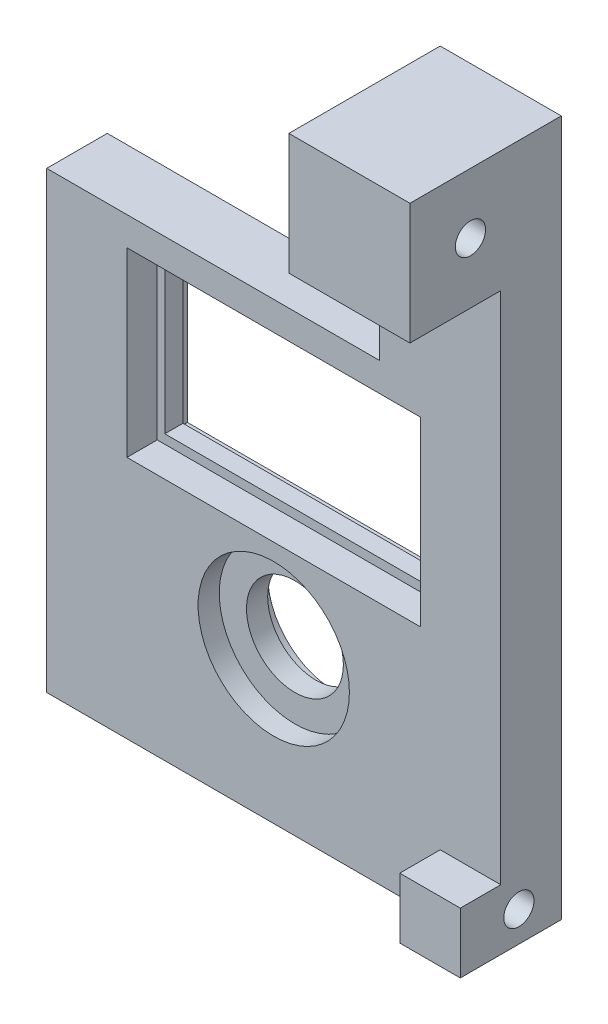
ISO-10303-21;
HEADER;
FILE_DESCRIPTION(('STEP AP214'),'2;1');
FILE_NAME('part.step','',(''),(''),'','','');
FILE_SCHEMA(('AUTOMOTIVE_DESIGN { 1 0 10303 214 1 1 1 1 }'));
ENDSEC;
DATA;
#1=APPLICATION_CONTEXT('core data for automotive mechanical design processes');
#2=APPLICATION_PROTOCOL_DEFINITION('international standard','automotive_design',2000,#1);
#3=PRODUCT_CONTEXT('',#1,'mechanical');
#4=PRODUCT('Part','Part','',(#3));
#5=PRODUCT_RELATED_PRODUCT_CATEGORY('part','',(#4));
#6=PRODUCT_DEFINITION_FORMATION('','',#4);
#7=PRODUCT_DEFINITION_CONTEXT('part definition',#1,'design');
#8=PRODUCT_DEFINITION('design','',#6,#7);
#9=PRODUCT_DEFINITION_SHAPE('','',#8);
#10=(LENGTH_UNIT() NAMED_UNIT(*) SI_UNIT(.MILLI.,.METRE.));
#11=(NAMED_UNIT(*) PLANE_ANGLE_UNIT() SI_UNIT($,.RADIAN.));
#12=(NAMED_UNIT(*) SI_UNIT($,.STERADIAN.) SOLID_ANGLE_UNIT());
#13=UNCERTAINTY_MEASURE_WITH_UNIT(LENGTH_MEASURE(1.E-05),#10,'distance_accuracy_value','');
#14=(GEOMETRIC_REPRESENTATION_CONTEXT(3) GLOBAL_UNCERTAINTY_ASSIGNED_CONTEXT((#13)) GLOBAL_UNIT_ASSIGNED_CONTEXT((#10,
#11,#12)) REPRESENTATION_CONTEXT('',''));
#15=CARTESIAN_POINT('',(0.,0.,0.));
#16=DIRECTION('',(0.,0.,1.));
#17=DIRECTION('',(1.,0.,0.));
#18=AXIS2_PLACEMENT_3D('',#15,#16,#17);
#19=CARTESIAN_POINT('',(-23.,-15.7340796764345,25.001));
#20=DIRECTION('',(-1.,0.,0.));
#21=DIRECTION('',(0.,0.,1.));
#22=AXIS2_PLACEMENT_3D('',#19,#20,#21);
#23=PLANE('',#22);
#24=DIRECTION('',(0.,1.,0.));
#25=VECTOR('',#24,1.);
#26=CARTESIAN_POINT('',(-23.,-15.7340796764345,5.));
#27=LINE('',#26,#25);
#28=CARTESIAN_POINT('',(-23.,-15.7340796764345,5.));
#29=VERTEX_POINT('',#28);
#30=CARTESIAN_POINT('',(-23.,11.2659203235655,5.));
#31=VERTEX_POINT('',#30);
#32=EDGE_CURVE('E60',#29,#31,#27,.T.);
#33=ORIENTED_EDGE('',*,*,#32,.F.);
#34=DIRECTION('',(0.,0.,-1.));
#35=VECTOR('',#34,1.);
#36=CARTESIAN_POINT('',(-23.,-15.7340796764345,25.001));
#37=LINE('',#36,#35);
#38=CARTESIAN_POINT('',(-23.,-15.7340796764345,2.));
#39=VERTEX_POINT('',#38);
#40=EDGE_CURVE('E274',#29,#39,#37,.T.);
#41=ORIENTED_EDGE('',*,*,#40,.T.);
#42=DIRECTION('',(0.,1.,0.));
#43=VECTOR('',#42,1.);
#44=CARTESIAN_POINT('',(-23.,-15.7340796764345,2.));
#45=LINE('',#44,#43);
#46=CARTESIAN_POINT('',(-23.,11.2659203235655,2.));
#47=VERTEX_POINT('',#46);
#48=EDGE_CURVE('E270',#39,#47,#45,.T.);
#49=ORIENTED_EDGE('',*,*,#48,.T.);
#50=DIRECTION('',(0.,0.,-1.));
#51=VECTOR('',#50,1.);
#52=CARTESIAN_POINT('',(-23.,11.2659203235655,25.001));
#53=LINE('',#52,#51);
#54=EDGE_CURVE('E273',#31,#47,#53,.T.);
#55=ORIENTED_EDGE('',*,*,#54,.F.);
#56=EDGE_LOOP('',(#33,#41,#49,#55));
#57=FACE_BOUND('',#56,.T.);
#58=ADVANCED_FACE('F38',(#57),#23,.F.);
#59=CARTESIAN_POINT('',(23.,-15.7340796764345,25.001));
#60=DIRECTION('',(0.,-1.,0.));
#61=DIRECTION('',(0.,0.,-1.));
#62=AXIS2_PLACEMENT_3D('',#59,#60,#61);
#63=PLANE('',#62);
#64=DIRECTION('',(-1.,0.,0.));
#65=VECTOR('',#64,1.);
#66=CARTESIAN_POINT('',(23.,-15.7340796764345,5.));
#67=LINE('',#66,#65);
#68=CARTESIAN_POINT('',(23.,-15.7340796764345,5.));
#69=VERTEX_POINT('',#68);
#70=EDGE_CURVE('E229',#69,#29,#67,.T.);
#71=ORIENTED_EDGE('',*,*,#70,.F.);
#72=DIRECTION('',(0.,0.,-1.));
#73=VECTOR('',#72,1.);
#74=CARTESIAN_POINT('',(23.,-15.7340796764345,25.001));
#75=LINE('',#74,#73);
#76=CARTESIAN_POINT('',(23.,-15.7340796764345,2.));
#77=VERTEX_POINT('',#76);
#78=EDGE_CURVE('E277',#69,#77,#75,.T.);
#79=ORIENTED_EDGE('',*,*,#78,.T.);
#80=DIRECTION('',(-1.,0.,0.));
#81=VECTOR('',#80,1.);
#82=CARTESIAN_POINT('',(23.,-15.7340796764345,2.));
#83=LINE('',#82,#81);
#84=EDGE_CURVE('E267',#77,#39,#83,.T.);
#85=ORIENTED_EDGE('',*,*,#84,.T.);
#86=ORIENTED_EDGE('',*,*,#40,.F.);
#87=EDGE_LOOP('',(#71,#79,#85,#86));
#88=FACE_BOUND('',#87,.T.);
#89=ADVANCED_FACE('F397',(#88),#63,.F.);
#90=CARTESIAN_POINT('',(23.,-15.7340796764345,25.001));
#91=DIRECTION('',(1.,0.,0.));
#92=DIRECTION('',(0.,1.,0.));
#93=AXIS2_PLACEMENT_3D('',#90,#91,#92);
#94=PLANE('',#93);
#95=DIRECTION('',(0.,-1.,0.));
#96=VECTOR('',#95,1.);
#97=CARTESIAN_POINT('',(23.,-15.7340796764345,5.));
#98=LINE('',#97,#96);
#99=CARTESIAN_POINT('',(23.,11.2659203235655,5.));
#100=VERTEX_POINT('',#99);
#101=EDGE_CURVE('E226',#100,#69,#98,.T.);
#102=ORIENTED_EDGE('',*,*,#101,.F.);
#103=DIRECTION('',(0.,0.,-1.));
#104=VECTOR('',#103,1.);
#105=CARTESIAN_POINT('',(23.,11.2659203235655,25.001));
#106=LINE('',#105,#104);
#107=CARTESIAN_POINT('',(23.,11.2659203235655,2.));
#108=VERTEX_POINT('',#107);
#109=EDGE_CURVE('E279',#100,#108,#106,.T.);
#110=ORIENTED_EDGE('',*,*,#109,.T.);
#111=DIRECTION('',(0.,-1.,0.));
#112=VECTOR('',#111,1.);
#113=CARTESIAN_POINT('',(23.,-15.7340796764345,2.));
#114=LINE('',#113,#112);
#115=EDGE_CURVE('E258',#108,#77,#114,.T.);
#116=ORIENTED_EDGE('',*,*,#115,.T.);
#117=ORIENTED_EDGE('',*,*,#78,.F.);
#118=EDGE_LOOP('',(#102,#110,#116,#117));
#119=FACE_BOUND('',#118,.T.);
#120=ADVANCED_FACE('F401',(#119),#94,.F.);
#121=CARTESIAN_POINT('',(23.,11.2659203235655,25.001));
#122=DIRECTION('',(0.,1.,0.));
#123=DIRECTION('',(0.,0.,1.));
#124=AXIS2_PLACEMENT_3D('',#121,#122,#123);
#125=PLANE('',#124);
#126=DIRECTION('',(1.,0.,0.));
#127=VECTOR('',#126,1.);
#128=CARTESIAN_POINT('',(23.,11.2659203235655,5.));
#129=LINE('',#128,#127);
#130=EDGE_CURVE('E12',#31,#100,#129,.T.);
#131=ORIENTED_EDGE('',*,*,#130,.F.);
#132=ORIENTED_EDGE('',*,*,#54,.T.);
#133=DIRECTION('',(1.,0.,0.));
#134=VECTOR('',#133,1.);
#135=CARTESIAN_POINT('',(23.,11.2659203235655,2.));
#136=LINE('',#135,#134);
#137=EDGE_CURVE('E46',#47,#108,#136,.T.);
#138=ORIENTED_EDGE('',*,*,#137,.T.);
#139=ORIENTED_EDGE('',*,*,#109,.F.);
#140=EDGE_LOOP('',(#131,#132,#138,#139));
#141=FACE_BOUND('',#140,.T.);
#142=ADVANCED_FACE('F386',(#141),#125,.F.);
#143=CARTESIAN_POINT('',(0.,0.,10.));
#144=DIRECTION('',(0.,0.,-1.));
#145=DIRECTION('',(-1.,0.,0.));
#146=AXIS2_PLACEMENT_3D('',#143,#144,#145);
#147=PLANE('',#146);
#148=DIRECTION('',(-1.,0.,0.));
#149=VECTOR('',#148,1.);
#150=CARTESIAN_POINT('',(-24.25,12.7659203235655,10.));
#151=LINE('',#150,#149);
#152=CARTESIAN_POINT('',(24.25,12.7659203235655,10.));
#153=VERTEX_POINT('',#152);
#154=CARTESIAN_POINT('',(-24.25,12.7659203235655,10.));
#155=VERTEX_POINT('',#154);
#156=EDGE_CURVE('E208',#153,#155,#151,.T.);
#157=ORIENTED_EDGE('',*,*,#156,.F.);
#158=DIRECTION('',(0.,1.,0.));
#159=VECTOR('',#158,1.);
#160=CARTESIAN_POINT('',(24.25,-17.2340796764345,10.));
#161=LINE('',#160,#159);
#162=CARTESIAN_POINT('',(24.25,-17.2340796764345,10.));
#163=VERTEX_POINT('',#162);
#164=EDGE_CURVE('E53',#163,#153,#161,.T.);
#165=ORIENTED_EDGE('',*,*,#164,.F.);
#166=DIRECTION('',(1.,0.,0.));
#167=VECTOR('',#166,1.);
#168=CARTESIAN_POINT('',(-24.25,-17.2340796764345,10.));
#169=LINE('',#168,#167);
#170=CARTESIAN_POINT('',(-24.25,-17.2340796764345,10.));
#171=VERTEX_POINT('',#170);
#172=EDGE_CURVE('E215',#171,#163,#169,.T.);
#173=ORIENTED_EDGE('',*,*,#172,.F.);
#174=DIRECTION('',(0.,-1.,0.));
#175=VECTOR('',#174,1.);
#176=CARTESIAN_POINT('',(-24.25,-17.2340796764345,10.));
#177=LINE('',#176,#175);
#178=EDGE_CURVE('E198',#155,#171,#177,.T.);
#179=ORIENTED_EDGE('',*,*,#178,.F.);
#180=EDGE_LOOP('',(#157,#165,#173,#179));
#181=FACE_BOUND('',#180,.T.);
#182=CARTESIAN_POINT('',(0.,-32.5,10.));
#183=DIRECTION('',(0.,0.,1.));
#184=DIRECTION('',(1.,0.,0.));
#185=AXIS2_PLACEMENT_3D('',#182,#183,#184);
#186=CIRCLE('',#185,12.5);
#187=CARTESIAN_POINT('',(12.5,-32.5,10.));
#188=VERTEX_POINT('',#187);
#189=EDGE_CURVE('E345',#188,#188,#186,.T.);
#190=ORIENTED_EDGE('',*,*,#189,.F.);
#191=EDGE_LOOP('',(#190));
#192=FACE_BOUND('',#191,.T.);
#193=DIRECTION('',(0.,1.,0.));
#194=VECTOR('',#193,1.);
#195=CARTESIAN_POINT('',(17.5,57.5,10.));
#196=LINE('',#195,#194);
#197=CARTESIAN_POINT('',(17.5,17.5,10.));
#198=VERTEX_POINT('',#197);
#199=CARTESIAN_POINT('',(17.5,37.5,10.));
#200=VERTEX_POINT('',#199);
#201=EDGE_CURVE('E284',#198,#200,#196,.T.);
#202=ORIENTED_EDGE('',*,*,#201,.F.);
#203=DIRECTION('',(1.,0.,0.));
#204=VECTOR('',#203,1.);
#205=CARTESIAN_POINT('',(17.5,17.5,10.));
#206=LINE('',#205,#204);
#207=CARTESIAN_POINT('',(-37.5,17.5,10.));
#208=VERTEX_POINT('',#207);
#209=EDGE_CURVE('E276',#208,#198,#206,.T.);
#210=ORIENTED_EDGE('',*,*,#209,.F.);
#211=DIRECTION('',(0.,-1.,0.));
#212=VECTOR('',#211,1.);
#213=CARTESIAN_POINT('',(-37.5,-57.5,10.));
#214=LINE('',#213,#212);
#215=CARTESIAN_POINT('',(-37.5,-57.5,10.));
#216=VERTEX_POINT('',#215);
#217=EDGE_CURVE('E350',#208,#216,#214,.T.);
#218=ORIENTED_EDGE('',*,*,#217,.T.);
#219=DIRECTION('',(1.,0.,0.));
#220=VECTOR('',#219,1.);
#221=CARTESIAN_POINT('',(-37.5,-57.5,10.));
#222=LINE('',#221,#220);
#223=CARTESIAN_POINT('',(27.5,-57.5,10.));
#224=VERTEX_POINT('',#223);
#225=EDGE_CURVE('E353',#216,#224,#222,.T.);
#226=ORIENTED_EDGE('',*,*,#225,.T.);
#227=DIRECTION('',(0.,1.,0.));
#228=VECTOR('',#227,1.);
#229=CARTESIAN_POINT('',(27.5,-57.5,10.));
#230=LINE('',#229,#228);
#231=CARTESIAN_POINT('',(27.5,-47.5,10.));
#232=VERTEX_POINT('',#231);
#233=EDGE_CURVE('E291',#224,#232,#230,.T.);
#234=ORIENTED_EDGE('',*,*,#233,.T.);
#235=DIRECTION('',(1.,0.,0.));
#236=VECTOR('',#235,1.);
#237=CARTESIAN_POINT('',(27.5,-47.5,10.));
#238=LINE('',#237,#236);
#239=CARTESIAN_POINT('',(37.5,-47.5,10.));
#240=VERTEX_POINT('',#239);
#241=EDGE_CURVE('E303',#232,#240,#238,.T.);
#242=ORIENTED_EDGE('',*,*,#241,.T.);
#243=DIRECTION('',(0.,1.,0.));
#244=VECTOR('',#243,1.);
#245=CARTESIAN_POINT('',(37.5,-57.5,10.));
#246=LINE('',#245,#244);
#247=CARTESIAN_POINT('',(37.5,37.5,10.));
#248=VERTEX_POINT('',#247);
#249=EDGE_CURVE('E348',#240,#248,#246,.T.);
#250=ORIENTED_EDGE('',*,*,#249,.T.);
#251=DIRECTION('',(1.,0.,0.));
#252=VECTOR('',#251,1.);
#253=CARTESIAN_POINT('',(17.5,37.5,10.));
#254=LINE('',#253,#252);
#255=EDGE_CURVE('E311',#200,#248,#254,.T.);
#256=ORIENTED_EDGE('',*,*,#255,.F.);
#257=EDGE_LOOP('',(#202,#210,#218,#226,#234,#242,#250,#256));
#258=FACE_BOUND('',#257,.T.);
#259=ADVANCED_FACE('F212',(#181,#192,#258),#147,.F.);
#260=CARTESIAN_POINT('',(-37.5,57.5,10.));
#261=DIRECTION('',(0.,-1.,0.));
#262=DIRECTION('',(0.,0.,-1.));
#263=AXIS2_PLACEMENT_3D('',#260,#261,#262);
#264=PLANE('',#263);
#265=DIRECTION('',(-1.,0.,0.));
#266=VECTOR('',#265,1.);
#267=CARTESIAN_POINT('',(-37.5,57.5,0.));
#268=LINE('',#267,#266);
#269=CARTESIAN_POINT('',(37.5,57.5,0.));
#270=VERTEX_POINT('',#269);
#271=CARTESIAN_POINT('',(17.5,57.5,0.));
#272=VERTEX_POINT('',#271);
#273=EDGE_CURVE('E359',#270,#272,#268,.T.);
#274=ORIENTED_EDGE('',*,*,#273,.T.);
#275=DIRECTION('',(0.,0.,-1.));
#276=VECTOR('',#275,1.);
#277=CARTESIAN_POINT('',(17.5,57.5,25.));
#278=LINE('',#277,#276);
#279=CARTESIAN_POINT('',(17.5,57.5,25.));
#280=VERTEX_POINT('',#279);
#281=EDGE_CURVE('E332',#280,#272,#278,.T.);
#282=ORIENTED_EDGE('',*,*,#281,.F.);
#283=DIRECTION('',(-1.,0.,0.));
#284=VECTOR('',#283,1.);
#285=CARTESIAN_POINT('',(37.5,57.5,25.));
#286=LINE('',#285,#284);
#287=CARTESIAN_POINT('',(37.5,57.5,25.));
#288=VERTEX_POINT('',#287);
#289=EDGE_CURVE('E318',#288,#280,#286,.T.);
#290=ORIENTED_EDGE('',*,*,#289,.F.);
#291=DIRECTION('',(0.,0.,-1.));
#292=VECTOR('',#291,1.);
#293=CARTESIAN_POINT('',(37.5,57.5,10.));
#294=LINE('',#293,#292);
#295=EDGE_CURVE('E370',#288,#270,#294,.T.);
#296=ORIENTED_EDGE('',*,*,#295,.T.);
#297=EDGE_LOOP('',(#274,#282,#290,#296));
#298=FACE_BOUND('',#297,.T.);
#299=ADVANCED_FACE('F481',(#298),#264,.F.);
#300=CARTESIAN_POINT('',(-37.5,-57.5,10.));
#301=DIRECTION('',(1.,0.,0.));
#302=DIRECTION('',(0.,0.,-1.));
#303=AXIS2_PLACEMENT_3D('',#300,#301,#302);
#304=PLANE('',#303);
#305=DIRECTION('',(0.,0.,1.));
#306=VECTOR('',#305,1.);
#307=CARTESIAN_POINT('',(-37.5,17.5,-1.2E-05));
#308=LINE('',#307,#306);
#309=CARTESIAN_POINT('',(-37.5,17.5,0.));
#310=VERTEX_POINT('',#309);
#311=EDGE_CURVE('E286',#310,#208,#308,.T.);
#312=ORIENTED_EDGE('',*,*,#311,.F.);
#313=DIRECTION('',(0.,-1.,0.));
#314=VECTOR('',#313,1.);
#315=CARTESIAN_POINT('',(-37.5,-57.5,0.));
#316=LINE('',#315,#314);
#317=CARTESIAN_POINT('',(-37.5,-57.5,0.));
#318=VERTEX_POINT('',#317);
#319=EDGE_CURVE('E362',#310,#318,#316,.T.);
#320=ORIENTED_EDGE('',*,*,#319,.T.);
#321=DIRECTION('',(0.,0.,-1.));
#322=VECTOR('',#321,1.);
#323=CARTESIAN_POINT('',(-37.5,-57.5,10.));
#324=LINE('',#323,#322);
#325=EDGE_CURVE('E367',#216,#318,#324,.T.);
#326=ORIENTED_EDGE('',*,*,#325,.F.);
#327=ORIENTED_EDGE('',*,*,#217,.F.);
#328=EDGE_LOOP('',(#312,#320,#326,#327));
#329=FACE_BOUND('',#328,.T.);
#330=ADVANCED_FACE('F484',(#329),#304,.F.);
#331=CARTESIAN_POINT('',(0.,0.,0.));
#332=DIRECTION('',(0.,0.,-1.));
#333=DIRECTION('',(-1.,0.,0.));
#334=AXIS2_PLACEMENT_3D('',#331,#332,#333);
#335=PLANE('',#334);
#336=DIRECTION('',(0.,1.,0.));
#337=VECTOR('',#336,1.);
#338=CARTESIAN_POINT('',(-24.25,-17.2340796764345,0.));
#339=LINE('',#338,#337);
#340=CARTESIAN_POINT('',(-24.25,-17.2340796764345,0.));
#341=VERTEX_POINT('',#340);
#342=CARTESIAN_POINT('',(-24.25,12.7659203235655,0.));
#343=VERTEX_POINT('',#342);
#344=EDGE_CURVE('E232',#341,#343,#339,.T.);
#345=ORIENTED_EDGE('',*,*,#344,.F.);
#346=DIRECTION('',(-1.,0.,0.));
#347=VECTOR('',#346,1.);
#348=CARTESIAN_POINT('',(24.25,-17.2340796764345,0.));
#349=LINE('',#348,#347);
#350=CARTESIAN_POINT('',(24.25,-17.2340796764345,0.));
#351=VERTEX_POINT('',#350);
#352=EDGE_CURVE('E237',#351,#341,#349,.T.);
#353=ORIENTED_EDGE('',*,*,#352,.F.);
#354=DIRECTION('',(0.,-1.,0.));
#355=VECTOR('',#354,1.);
#356=CARTESIAN_POINT('',(24.25,-17.2340796764345,0.));
#357=LINE('',#356,#355);
#358=CARTESIAN_POINT('',(24.25,12.7659203235655,0.));
#359=VERTEX_POINT('',#358);
#360=EDGE_CURVE('E251',#359,#351,#357,.T.);
#361=ORIENTED_EDGE('',*,*,#360,.F.);
#362=DIRECTION('',(1.,0.,0.));
#363=VECTOR('',#362,1.);
#364=CARTESIAN_POINT('',(24.25,12.7659203235655,0.));
#365=LINE('',#364,#363);
#366=EDGE_CURVE('E248',#343,#359,#365,.T.);
#367=ORIENTED_EDGE('',*,*,#366,.F.);
#368=EDGE_LOOP('',(#345,#353,#361,#367));
#369=FACE_BOUND('',#368,.T.);
#370=CARTESIAN_POINT('',(0.,-32.5,0.));
#371=DIRECTION('',(0.,0.,-1.));
#372=DIRECTION('',(-1.,0.,0.));
#373=AXIS2_PLACEMENT_3D('',#370,#371,#372);
#374=CIRCLE('',#373,11.);
#375=CARTESIAN_POINT('',(-11.,-32.5,0.));
#376=VERTEX_POINT('',#375);
#377=EDGE_CURVE('E334',#376,#376,#374,.T.);
#378=ORIENTED_EDGE('',*,*,#377,.F.);
#379=EDGE_LOOP('',(#378));
#380=FACE_BOUND('',#379,.T.);
#381=DIRECTION('',(1.,0.,0.));
#382=VECTOR('',#381,1.);
#383=CARTESIAN_POINT('',(0.,17.5,0.));
#384=LINE('',#383,#382);
#385=CARTESIAN_POINT('',(17.5,17.5,0.));
#386=VERTEX_POINT('',#385);
#387=EDGE_CURVE('E373',#310,#386,#384,.T.);
#388=ORIENTED_EDGE('',*,*,#387,.T.);
#389=DIRECTION('',(0.,1.,0.));
#390=VECTOR('',#389,1.);
#391=CARTESIAN_POINT('',(17.5,0.,0.));
#392=LINE('',#391,#390);
#393=EDGE_CURVE('E380',#386,#272,#392,.T.);
#394=ORIENTED_EDGE('',*,*,#393,.T.);
#395=ORIENTED_EDGE('',*,*,#273,.F.);
#396=DIRECTION('',(0.,1.,0.));
#397=VECTOR('',#396,1.);
#398=CARTESIAN_POINT('',(37.5,-57.5,0.));
#399=LINE('',#398,#397);
#400=CARTESIAN_POINT('',(37.5,-57.5,0.));
#401=VERTEX_POINT('',#400);
#402=EDGE_CURVE('E356',#401,#270,#399,.T.);
#403=ORIENTED_EDGE('',*,*,#402,.F.);
#404=DIRECTION('',(1.,0.,0.));
#405=VECTOR('',#404,1.);
#406=CARTESIAN_POINT('',(-37.5,-57.5,0.));
#407=LINE('',#406,#405);
#408=EDGE_CURVE('E351',#318,#401,#407,.T.);
#409=ORIENTED_EDGE('',*,*,#408,.F.);
#410=ORIENTED_EDGE('',*,*,#319,.F.);
#411=EDGE_LOOP('',(#388,#394,#395,#403,#409,#410));
#412=FACE_BOUND('',#411,.T.);
#413=ADVANCED_FACE('F477',(#369,#380,#412),#335,.T.);
#414=CARTESIAN_POINT('',(0.,-32.5,-0.000999999999999265));
#415=DIRECTION('',(0.,0.,1.));
#416=DIRECTION('',(1.,0.,0.));
#417=AXIS2_PLACEMENT_3D('',#414,#415,#416);
#418=CYLINDRICAL_SURFACE('',#417,8.);
#419=CARTESIAN_POINT('',(0.,-32.5,6.5));
#420=DIRECTION('',(0.,0.,1.));
#421=DIRECTION('',(1.,0.,0.));
#422=AXIS2_PLACEMENT_3D('',#419,#420,#421);
#423=CIRCLE('',#422,8.);
#424=CARTESIAN_POINT('',(8.,-32.5,6.5));
#425=VERTEX_POINT('',#424);
#426=EDGE_CURVE('E344',#425,#425,#423,.F.);
#427=ORIENTED_EDGE('',*,*,#426,.F.);
#428=EDGE_LOOP('',(#427));
#429=FACE_BOUND('',#428,.T.);
#430=CARTESIAN_POINT('',(0.,-32.5,3.));
#431=DIRECTION('',(0.,0.,-1.));
#432=DIRECTION('',(-1.,0.,0.));
#433=AXIS2_PLACEMENT_3D('',#430,#431,#432);
#434=CIRCLE('',#433,8.);
#435=CARTESIAN_POINT('',(-8.,-32.5,3.));
#436=VERTEX_POINT('',#435);
#437=EDGE_CURVE('E338',#436,#436,#434,.F.);
#438=ORIENTED_EDGE('',*,*,#437,.F.);
#439=EDGE_LOOP('',(#438));
#440=FACE_BOUND('',#439,.T.);
#441=ADVANCED_FACE('F474',(#429,#440),#418,.F.);
#442=CARTESIAN_POINT('',(37.5,-57.5,10.));
#443=DIRECTION('',(-1.,0.,0.));
#444=DIRECTION('',(0.,0.,1.));
#445=AXIS2_PLACEMENT_3D('',#442,#443,#444);
#446=PLANE('',#445);
#447=CARTESIAN_POINT('',(37.5,47.5,14.9999999999999));
#448=DIRECTION('',(1.,0.,0.));
#449=DIRECTION('',(0.,0.,-1.));
#450=AXIS2_PLACEMENT_3D('',#447,#448,#449);
#451=CIRCLE('',#450,2.5);
#452=CARTESIAN_POINT('',(37.5,47.5,12.4999999999999));
#453=VERTEX_POINT('',#452);
#454=EDGE_CURVE('E531',#453,#453,#451,.T.);
#455=ORIENTED_EDGE('',*,*,#454,.F.);
#456=EDGE_LOOP('',(#455));
#457=FACE_BOUND('',#456,.T.);
#458=CARTESIAN_POINT('',(37.5,-52.5000000000001,6.99999999999995));
#459=DIRECTION('',(1.,0.,0.));
#460=DIRECTION('',(0.,0.,-1.));
#461=AXIS2_PLACEMENT_3D('',#458,#459,#460);
#462=CIRCLE('',#461,2.5);
#463=CARTESIAN_POINT('',(37.5,-52.5000000000001,4.49999999999996));
#464=VERTEX_POINT('',#463);
#465=EDGE_CURVE('E534',#464,#464,#462,.T.);
#466=ORIENTED_EDGE('',*,*,#465,.F.);
#467=EDGE_LOOP('',(#466));
#468=FACE_BOUND('',#467,.T.);
#469=ORIENTED_EDGE('',*,*,#402,.T.);
#470=ORIENTED_EDGE('',*,*,#295,.F.);
#471=DIRECTION('',(0.,1.,0.));
#472=VECTOR('',#471,1.);
#473=CARTESIAN_POINT('',(37.5,37.5,25.));
#474=LINE('',#473,#472);
#475=CARTESIAN_POINT('',(37.5,37.5,25.));
#476=VERTEX_POINT('',#475);
#477=EDGE_CURVE('E315',#476,#288,#474,.T.);
#478=ORIENTED_EDGE('',*,*,#477,.F.);
#479=DIRECTION('',(0.,0.,-1.));
#480=VECTOR('',#479,1.);
#481=CARTESIAN_POINT('',(37.5,37.5,25.));
#482=LINE('',#481,#480);
#483=EDGE_CURVE('E324',#476,#248,#482,.T.);
#484=ORIENTED_EDGE('',*,*,#483,.T.);
#485=ORIENTED_EDGE('',*,*,#249,.F.);
#486=DIRECTION('',(0.,0.,1.));
#487=VECTOR('',#486,1.);
#488=CARTESIAN_POINT('',(37.5,-47.5,16.6817856176358));
#489=LINE('',#488,#487);
#490=CARTESIAN_POINT('',(37.5,-47.5,16.6817856176358));
#491=VERTEX_POINT('',#490);
#492=EDGE_CURVE('E290',#240,#491,#489,.T.);
#493=ORIENTED_EDGE('',*,*,#492,.T.);
#494=DIRECTION('',(0.,-1.,0.));
#495=VECTOR('',#494,1.);
#496=CARTESIAN_POINT('',(37.5,-57.5,16.6817856176358));
#497=LINE('',#496,#495);
#498=CARTESIAN_POINT('',(37.5,-57.5,16.6817856176358));
#499=VERTEX_POINT('',#498);
#500=EDGE_CURVE('E294',#491,#499,#497,.T.);
#501=ORIENTED_EDGE('',*,*,#500,.T.);
#502=DIRECTION('',(0.,0.,-1.));
#503=VECTOR('',#502,1.);
#504=CARTESIAN_POINT('',(37.5,-57.5,10.));
#505=LINE('',#504,#503);
#506=EDGE_CURVE('E355',#499,#401,#505,.T.);
#507=ORIENTED_EDGE('',*,*,#506,.T.);
#508=EDGE_LOOP('',(#469,#470,#478,#484,#485,#493,#501,#507));
#509=FACE_BOUND('',#508,.T.);
#510=ADVANCED_FACE('F40',(#457,#468,#509),#446,.F.);
#511=CARTESIAN_POINT('',(-37.5,-57.5,10.));
#512=DIRECTION('',(0.,1.,0.));
#513=DIRECTION('',(0.,0.,1.));
#514=AXIS2_PLACEMENT_3D('',#511,#512,#513);
#515=PLANE('',#514);
#516=ORIENTED_EDGE('',*,*,#408,.T.);
#517=ORIENTED_EDGE('',*,*,#506,.F.);
#518=DIRECTION('',(1.,0.,0.));
#519=VECTOR('',#518,1.);
#520=CARTESIAN_POINT('',(27.5,-57.5,16.6817856176358));
#521=LINE('',#520,#519);
#522=CARTESIAN_POINT('',(27.5,-57.5,16.6817856176358));
#523=VERTEX_POINT('',#522);
#524=EDGE_CURVE('E308',#523,#499,#521,.T.);
#525=ORIENTED_EDGE('',*,*,#524,.F.);
#526=DIRECTION('',(0.,0.,-1.));
#527=VECTOR('',#526,1.);
#528=CARTESIAN_POINT('',(27.5,-57.5,10.));
#529=LINE('',#528,#527);
#530=EDGE_CURVE('E300',#523,#224,#529,.T.);
#531=ORIENTED_EDGE('',*,*,#530,.T.);
#532=ORIENTED_EDGE('',*,*,#225,.F.);
#533=ORIENTED_EDGE('',*,*,#325,.T.);
#534=EDGE_LOOP('',(#516,#517,#525,#531,#532,#533));
#535=FACE_BOUND('',#534,.T.);
#536=ADVANCED_FACE('F469',(#535),#515,.F.);
#537=CARTESIAN_POINT('',(0.,-32.5,6.5));
#538=DIRECTION('',(0.,0.,1.));
#539=DIRECTION('',(1.,0.,0.));
#540=AXIS2_PLACEMENT_3D('',#537,#538,#539);
#541=PLANE('',#540);
#542=CARTESIAN_POINT('',(0.,-32.5,6.5));
#543=DIRECTION('',(0.,0.,1.));
#544=DIRECTION('',(1.,0.,0.));
#545=AXIS2_PLACEMENT_3D('',#542,#543,#544);
#546=CIRCLE('',#545,12.5);
#547=CARTESIAN_POINT('',(12.5,-32.5,6.5));
#548=VERTEX_POINT('',#547);
#549=EDGE_CURVE('E341',#548,#548,#546,.T.);
#550=ORIENTED_EDGE('',*,*,#549,.T.);
#551=EDGE_LOOP('',(#550));
#552=FACE_BOUND('',#551,.T.);
#553=ORIENTED_EDGE('',*,*,#426,.T.);
#554=EDGE_LOOP('',(#553));
#555=FACE_BOUND('',#554,.T.);
#556=ADVANCED_FACE('F466',(#552,#555),#541,.T.);
#557=CARTESIAN_POINT('',(0.,-32.5,6.5));
#558=DIRECTION('',(0.,0.,1.));
#559=DIRECTION('',(1.,0.,0.));
#560=AXIS2_PLACEMENT_3D('',#557,#558,#559);
#561=CYLINDRICAL_SURFACE('',#560,12.5);
#562=ORIENTED_EDGE('',*,*,#549,.F.);
#563=EDGE_LOOP('',(#562));
#564=FACE_BOUND('',#563,.T.);
#565=ORIENTED_EDGE('',*,*,#189,.T.);
#566=EDGE_LOOP('',(#565));
#567=FACE_BOUND('',#566,.T.);
#568=ADVANCED_FACE('F461',(#564,#567),#561,.F.);
#569=CARTESIAN_POINT('',(0.,-32.5,3.));
#570=DIRECTION('',(0.,0.,-1.));
#571=DIRECTION('',(-1.,0.,0.));
#572=AXIS2_PLACEMENT_3D('',#569,#570,#571);
#573=PLANE('',#572);
#574=CARTESIAN_POINT('',(0.,-32.5,3.));
#575=DIRECTION('',(0.,0.,-1.));
#576=DIRECTION('',(-1.,0.,0.));
#577=AXIS2_PLACEMENT_3D('',#574,#575,#576);
#578=CIRCLE('',#577,11.);
#579=CARTESIAN_POINT('',(-11.,-32.5,3.));
#580=VERTEX_POINT('',#579);
#581=EDGE_CURVE('E335',#580,#580,#578,.T.);
#582=ORIENTED_EDGE('',*,*,#581,.T.);
#583=EDGE_LOOP('',(#582));
#584=FACE_BOUND('',#583,.T.);
#585=ORIENTED_EDGE('',*,*,#437,.T.);
#586=EDGE_LOOP('',(#585));
#587=FACE_BOUND('',#586,.T.);
#588=ADVANCED_FACE('F458',(#584,#587),#573,.T.);
#589=CARTESIAN_POINT('',(0.,-32.5,3.));
#590=DIRECTION('',(0.,0.,-1.));
#591=DIRECTION('',(-1.,0.,0.));
#592=AXIS2_PLACEMENT_3D('',#589,#590,#591);
#593=CYLINDRICAL_SURFACE('',#592,11.);
#594=ORIENTED_EDGE('',*,*,#581,.F.);
#595=EDGE_LOOP('',(#594));
#596=FACE_BOUND('',#595,.T.);
#597=ORIENTED_EDGE('',*,*,#377,.T.);
#598=EDGE_LOOP('',(#597));
#599=FACE_BOUND('',#598,.T.);
#600=ADVANCED_FACE('F456',(#596,#599),#593,.F.);
#601=CARTESIAN_POINT('',(17.5,57.5,25.));
#602=DIRECTION('',(1.,0.,0.));
#603=DIRECTION('',(0.,1.,0.));
#604=AXIS2_PLACEMENT_3D('',#601,#602,#603);
#605=PLANE('',#604);
#606=ORIENTED_EDGE('',*,*,#281,.T.);
#607=ORIENTED_EDGE('',*,*,#393,.F.);
#608=DIRECTION('',(0.,0.,1.));
#609=VECTOR('',#608,1.);
#610=CARTESIAN_POINT('',(17.5,17.5,-1.2E-05));
#611=LINE('',#610,#609);
#612=EDGE_CURVE('E288',#386,#198,#611,.T.);
#613=ORIENTED_EDGE('',*,*,#612,.T.);
#614=ORIENTED_EDGE('',*,*,#201,.T.);
#615=DIRECTION('',(0.,0.,-1.));
#616=VECTOR('',#615,1.);
#617=CARTESIAN_POINT('',(17.5,37.5,25.));
#618=LINE('',#617,#616);
#619=CARTESIAN_POINT('',(17.5,37.5,25.));
#620=VERTEX_POINT('',#619);
#621=EDGE_CURVE('E329',#620,#200,#618,.T.);
#622=ORIENTED_EDGE('',*,*,#621,.F.);
#623=DIRECTION('',(0.,-1.,0.));
#624=VECTOR('',#623,1.);
#625=CARTESIAN_POINT('',(17.5,57.5,25.));
#626=LINE('',#625,#624);
#627=EDGE_CURVE('E320',#280,#620,#626,.T.);
#628=ORIENTED_EDGE('',*,*,#627,.F.);
#629=EDGE_LOOP('',(#606,#607,#613,#614,#622,#628));
#630=FACE_BOUND('',#629,.T.);
#631=ADVANCED_FACE('F452',(#630),#605,.F.);
#632=CARTESIAN_POINT('',(17.5,37.5,25.));
#633=DIRECTION('',(0.,1.,0.));
#634=DIRECTION('',(0.,0.,1.));
#635=AXIS2_PLACEMENT_3D('',#632,#633,#634);
#636=PLANE('',#635);
#637=ORIENTED_EDGE('',*,*,#255,.T.);
#638=ORIENTED_EDGE('',*,*,#483,.F.);
#639=DIRECTION('',(1.,0.,0.));
#640=VECTOR('',#639,1.);
#641=CARTESIAN_POINT('',(17.5,37.5,25.));
#642=LINE('',#641,#640);
#643=EDGE_CURVE('E322',#620,#476,#642,.T.);
#644=ORIENTED_EDGE('',*,*,#643,.F.);
#645=ORIENTED_EDGE('',*,*,#621,.T.);
#646=EDGE_LOOP('',(#637,#638,#644,#645));
#647=FACE_BOUND('',#646,.T.);
#648=ADVANCED_FACE('F448',(#647),#636,.F.);
#649=CARTESIAN_POINT('',(0.,0.,25.));
#650=DIRECTION('',(0.,0.,1.));
#651=DIRECTION('',(1.,0.,0.));
#652=AXIS2_PLACEMENT_3D('',#649,#650,#651);
#653=PLANE('',#652);
#654=ORIENTED_EDGE('',*,*,#477,.T.);
#655=ORIENTED_EDGE('',*,*,#289,.T.);
#656=ORIENTED_EDGE('',*,*,#627,.T.);
#657=ORIENTED_EDGE('',*,*,#643,.T.);
#658=EDGE_LOOP('',(#654,#655,#656,#657));
#659=FACE_BOUND('',#658,.T.);
#660=ADVANCED_FACE('F441',(#659),#653,.T.);
#661=CARTESIAN_POINT('',(27.5,-57.5,16.6817856176358));
#662=DIRECTION('',(0.,0.,1.));
#663=DIRECTION('',(1.,0.,0.));
#664=AXIS2_PLACEMENT_3D('',#661,#662,#663);
#665=PLANE('',#664);
#666=ORIENTED_EDGE('',*,*,#500,.F.);
#667=DIRECTION('',(1.,0.,0.));
#668=VECTOR('',#667,1.);
#669=CARTESIAN_POINT('',(27.5,-47.5,16.6817856176358));
#670=LINE('',#669,#668);
#671=CARTESIAN_POINT('',(27.5,-47.5,16.6817856176358));
#672=VERTEX_POINT('',#671);
#673=EDGE_CURVE('E312',#672,#491,#670,.T.);
#674=ORIENTED_EDGE('',*,*,#673,.F.);
#675=DIRECTION('',(0.,-1.,0.));
#676=VECTOR('',#675,1.);
#677=CARTESIAN_POINT('',(27.5,-57.5,16.6817856176358));
#678=LINE('',#677,#676);
#679=EDGE_CURVE('E297',#672,#523,#678,.T.);
#680=ORIENTED_EDGE('',*,*,#679,.T.);
#681=ORIENTED_EDGE('',*,*,#524,.T.);
#682=EDGE_LOOP('',(#666,#674,#680,#681));
#683=FACE_BOUND('',#682,.T.);
#684=ADVANCED_FACE('F438',(#683),#665,.T.);
#685=CARTESIAN_POINT('',(27.5,-47.5,16.6817856176358));
#686=DIRECTION('',(0.,1.,0.));
#687=DIRECTION('',(0.,0.,1.));
#688=AXIS2_PLACEMENT_3D('',#685,#686,#687);
#689=PLANE('',#688);
#690=ORIENTED_EDGE('',*,*,#492,.F.);
#691=ORIENTED_EDGE('',*,*,#241,.F.);
#692=DIRECTION('',(0.,0.,1.));
#693=VECTOR('',#692,1.);
#694=CARTESIAN_POINT('',(27.5,-47.5,16.6817856176358));
#695=LINE('',#694,#693);
#696=EDGE_CURVE('E293',#232,#672,#695,.T.);
#697=ORIENTED_EDGE('',*,*,#696,.T.);
#698=ORIENTED_EDGE('',*,*,#673,.T.);
#699=EDGE_LOOP('',(#690,#691,#697,#698));
#700=FACE_BOUND('',#699,.T.);
#701=ADVANCED_FACE('F436',(#700),#689,.T.);
#702=CARTESIAN_POINT('',(27.5,0.,0.));
#703=DIRECTION('',(-1.,0.,0.));
#704=DIRECTION('',(0.,0.,1.));
#705=AXIS2_PLACEMENT_3D('',#702,#703,#704);
#706=PLANE('',#705);
#707=ORIENTED_EDGE('',*,*,#233,.F.);
#708=ORIENTED_EDGE('',*,*,#530,.F.);
#709=ORIENTED_EDGE('',*,*,#679,.F.);
#710=ORIENTED_EDGE('',*,*,#696,.F.);
#711=EDGE_LOOP('',(#707,#708,#709,#710));
#712=FACE_BOUND('',#711,.T.);
#713=ADVANCED_FACE('F432',(#712),#706,.T.);
#714=CARTESIAN_POINT('',(17.5,17.5,-1.2E-05));
#715=DIRECTION('',(0.,1.,0.));
#716=DIRECTION('',(0.,0.,1.));
#717=AXIS2_PLACEMENT_3D('',#714,#715,#716);
#718=PLANE('',#717);
#719=ORIENTED_EDGE('',*,*,#311,.T.);
#720=ORIENTED_EDGE('',*,*,#209,.T.);
#721=ORIENTED_EDGE('',*,*,#612,.F.);
#722=ORIENTED_EDGE('',*,*,#387,.F.);
#723=EDGE_LOOP('',(#719,#720,#721,#722));
#724=FACE_BOUND('',#723,.T.);
#725=ADVANCED_FACE('F429',(#724),#718,.T.);
#726=CARTESIAN_POINT('',(0.,0.,2.));
#727=DIRECTION('',(0.,0.,1.));
#728=DIRECTION('',(1.,0.,0.));
#729=AXIS2_PLACEMENT_3D('',#726,#727,#728);
#730=PLANE('',#729);
#731=DIRECTION('',(0.,1.,0.));
#732=VECTOR('',#731,1.);
#733=CARTESIAN_POINT('',(-24.25,-17.2340796764345,2.));
#734=LINE('',#733,#732);
#735=CARTESIAN_POINT('',(-24.25,-17.2340796764345,2.));
#736=VERTEX_POINT('',#735);
#737=CARTESIAN_POINT('',(-24.25,12.7659203235655,2.));
#738=VERTEX_POINT('',#737);
#739=EDGE_CURVE('E233',#736,#738,#734,.T.);
#740=ORIENTED_EDGE('',*,*,#739,.T.);
#741=DIRECTION('',(1.,0.,0.));
#742=VECTOR('',#741,1.);
#743=CARTESIAN_POINT('',(24.25,12.7659203235655,2.));
#744=LINE('',#743,#742);
#745=CARTESIAN_POINT('',(24.25,12.7659203235655,2.));
#746=VERTEX_POINT('',#745);
#747=EDGE_CURVE('E236',#738,#746,#744,.T.);
#748=ORIENTED_EDGE('',*,*,#747,.T.);
#749=DIRECTION('',(0.,-1.,0.));
#750=VECTOR('',#749,1.);
#751=CARTESIAN_POINT('',(24.25,-17.2340796764345,2.));
#752=LINE('',#751,#750);
#753=CARTESIAN_POINT('',(24.25,-17.2340796764345,2.));
#754=VERTEX_POINT('',#753);
#755=EDGE_CURVE('E240',#746,#754,#752,.T.);
#756=ORIENTED_EDGE('',*,*,#755,.T.);
#757=DIRECTION('',(-1.,0.,0.));
#758=VECTOR('',#757,1.);
#759=CARTESIAN_POINT('',(24.25,-17.2340796764345,2.));
#760=LINE('',#759,#758);
#761=EDGE_CURVE('E243',#754,#736,#760,.T.);
#762=ORIENTED_EDGE('',*,*,#761,.T.);
#763=EDGE_LOOP('',(#740,#748,#756,#762));
#764=FACE_BOUND('',#763,.T.);
#765=ORIENTED_EDGE('',*,*,#84,.F.);
#766=ORIENTED_EDGE('',*,*,#115,.F.);
#767=ORIENTED_EDGE('',*,*,#137,.F.);
#768=ORIENTED_EDGE('',*,*,#48,.F.);
#769=EDGE_LOOP('',(#765,#766,#767,#768));
#770=FACE_BOUND('',#769,.T.);
#771=ADVANCED_FACE('F392',(#764,#770),#730,.F.);
#772=CARTESIAN_POINT('',(-24.25,-17.2340796764345,2.));
#773=DIRECTION('',(-1.,0.,0.));
#774=DIRECTION('',(0.,-1.,0.));
#775=AXIS2_PLACEMENT_3D('',#772,#773,#774);
#776=PLANE('',#775);
#777=ORIENTED_EDGE('',*,*,#344,.T.);
#778=DIRECTION('',(0.,0.,-1.));
#779=VECTOR('',#778,1.);
#780=CARTESIAN_POINT('',(-24.25,12.7659203235655,2.));
#781=LINE('',#780,#779);
#782=EDGE_CURVE('E246',#738,#343,#781,.T.);
#783=ORIENTED_EDGE('',*,*,#782,.F.);
#784=ORIENTED_EDGE('',*,*,#739,.F.);
#785=DIRECTION('',(0.,0.,-1.));
#786=VECTOR('',#785,1.);
#787=CARTESIAN_POINT('',(-24.25,-17.2340796764345,2.));
#788=LINE('',#787,#786);
#789=EDGE_CURVE('E256',#736,#341,#788,.T.);
#790=ORIENTED_EDGE('',*,*,#789,.T.);
#791=EDGE_LOOP('',(#777,#783,#784,#790));
#792=FACE_BOUND('',#791,.T.);
#793=ADVANCED_FACE('F579',(#792),#776,.F.);
#794=CARTESIAN_POINT('',(24.25,-17.2340796764345,2.));
#795=DIRECTION('',(0.,-1.,0.));
#796=DIRECTION('',(0.,0.,-1.));
#797=AXIS2_PLACEMENT_3D('',#794,#795,#796);
#798=PLANE('',#797);
#799=ORIENTED_EDGE('',*,*,#352,.T.);
#800=ORIENTED_EDGE('',*,*,#789,.F.);
#801=ORIENTED_EDGE('',*,*,#761,.F.);
#802=DIRECTION('',(0.,0.,-1.));
#803=VECTOR('',#802,1.);
#804=CARTESIAN_POINT('',(24.25,-17.2340796764345,2.));
#805=LINE('',#804,#803);
#806=EDGE_CURVE('E259',#754,#351,#805,.T.);
#807=ORIENTED_EDGE('',*,*,#806,.T.);
#808=EDGE_LOOP('',(#799,#800,#801,#807));
#809=FACE_BOUND('',#808,.T.);
#810=ADVANCED_FACE('F581',(#809),#798,.F.);
#811=CARTESIAN_POINT('',(24.25,-17.2340796764345,2.));
#812=DIRECTION('',(1.,0.,0.));
#813=DIRECTION('',(0.,1.,0.));
#814=AXIS2_PLACEMENT_3D('',#811,#812,#813);
#815=PLANE('',#814);
#816=ORIENTED_EDGE('',*,*,#360,.T.);
#817=ORIENTED_EDGE('',*,*,#806,.F.);
#818=ORIENTED_EDGE('',*,*,#755,.F.);
#819=DIRECTION('',(0.,0.,-1.));
#820=VECTOR('',#819,1.);
#821=CARTESIAN_POINT('',(24.25,12.7659203235655,2.));
#822=LINE('',#821,#820);
#823=EDGE_CURVE('E261',#746,#359,#822,.T.);
#824=ORIENTED_EDGE('',*,*,#823,.T.);
#825=EDGE_LOOP('',(#816,#817,#818,#824));
#826=FACE_BOUND('',#825,.T.);
#827=ADVANCED_FACE('F414',(#826),#815,.F.);
#828=CARTESIAN_POINT('',(24.25,12.7659203235655,2.));
#829=DIRECTION('',(0.,1.,0.));
#830=DIRECTION('',(0.,0.,1.));
#831=AXIS2_PLACEMENT_3D('',#828,#829,#830);
#832=PLANE('',#831);
#833=ORIENTED_EDGE('',*,*,#366,.T.);
#834=ORIENTED_EDGE('',*,*,#823,.F.);
#835=ORIENTED_EDGE('',*,*,#747,.F.);
#836=ORIENTED_EDGE('',*,*,#782,.T.);
#837=EDGE_LOOP('',(#833,#834,#835,#836));
#838=FACE_BOUND('',#837,.T.);
#839=ADVANCED_FACE('F405',(#838),#832,.F.);
#840=CARTESIAN_POINT('',(0.,0.,5.));
#841=DIRECTION('',(0.,0.,1.));
#842=DIRECTION('',(1.,0.,0.));
#843=AXIS2_PLACEMENT_3D('',#840,#841,#842);
#844=PLANE('',#843);
#845=DIRECTION('',(0.,-1.,0.));
#846=VECTOR('',#845,1.);
#847=CARTESIAN_POINT('',(24.25,-17.2340796764345,5.));
#848=LINE('',#847,#846);
#849=CARTESIAN_POINT('',(24.25,12.7659203235655,5.));
#850=VERTEX_POINT('',#849);
#851=CARTESIAN_POINT('',(24.25,-17.2340796764345,5.));
#852=VERTEX_POINT('',#851);
#853=EDGE_CURVE('E227',#850,#852,#848,.T.);
#854=ORIENTED_EDGE('',*,*,#853,.F.);
#855=DIRECTION('',(1.,0.,0.));
#856=VECTOR('',#855,1.);
#857=CARTESIAN_POINT('',(-24.25,12.7659203235655,5.));
#858=LINE('',#857,#856);
#859=CARTESIAN_POINT('',(-24.25,12.7659203235655,5.));
#860=VERTEX_POINT('',#859);
#861=EDGE_CURVE('E224',#860,#850,#858,.T.);
#862=ORIENTED_EDGE('',*,*,#861,.F.);
#863=DIRECTION('',(0.,1.,0.));
#864=VECTOR('',#863,1.);
#865=CARTESIAN_POINT('',(-24.25,-17.2340796764345,5.));
#866=LINE('',#865,#864);
#867=CARTESIAN_POINT('',(-24.25,-17.2340796764345,5.));
#868=VERTEX_POINT('',#867);
#869=EDGE_CURVE('E201',#868,#860,#866,.T.);
#870=ORIENTED_EDGE('',*,*,#869,.F.);
#871=DIRECTION('',(-1.,0.,0.));
#872=VECTOR('',#871,1.);
#873=CARTESIAN_POINT('',(-24.25,-17.2340796764345,5.));
#874=LINE('',#873,#872);
#875=EDGE_CURVE('E543',#852,#868,#874,.T.);
#876=ORIENTED_EDGE('',*,*,#875,.F.);
#877=EDGE_LOOP('',(#854,#862,#870,#876));
#878=FACE_BOUND('',#877,.T.);
#879=ORIENTED_EDGE('',*,*,#32,.T.);
#880=ORIENTED_EDGE('',*,*,#130,.T.);
#881=ORIENTED_EDGE('',*,*,#101,.T.);
#882=ORIENTED_EDGE('',*,*,#70,.T.);
#883=EDGE_LOOP('',(#879,#880,#881,#882));
#884=FACE_BOUND('',#883,.T.);
#885=ADVANCED_FACE('F402',(#878,#884),#844,.T.);
#886=CARTESIAN_POINT('',(24.25,-17.2340796764345,-55.0285016461067));
#887=DIRECTION('',(1.,0.,0.));
#888=DIRECTION('',(0.,0.,-1.));
#889=AXIS2_PLACEMENT_3D('',#886,#887,#888);
#890=PLANE('',#889);
#891=ORIENTED_EDGE('',*,*,#853,.T.);
#892=DIRECTION('',(0.,0.,1.));
#893=VECTOR('',#892,1.);
#894=CARTESIAN_POINT('',(24.25,-17.2340796764345,-55.0285016461067));
#895=LINE('',#894,#893);
#896=EDGE_CURVE('E220',#852,#163,#895,.T.);
#897=ORIENTED_EDGE('',*,*,#896,.T.);
#898=ORIENTED_EDGE('',*,*,#164,.T.);
#899=DIRECTION('',(0.,0.,1.));
#900=VECTOR('',#899,1.);
#901=CARTESIAN_POINT('',(24.25,12.7659203235655,-55.0285016461067));
#902=LINE('',#901,#900);
#903=EDGE_CURVE('E205',#850,#153,#902,.T.);
#904=ORIENTED_EDGE('',*,*,#903,.F.);
#905=EDGE_LOOP('',(#891,#897,#898,#904));
#906=FACE_BOUND('',#905,.T.);
#907=ADVANCED_FACE('F404',(#906),#890,.F.);
#908=CARTESIAN_POINT('',(-24.25,-17.2340796764345,-55.0285016461067));
#909=DIRECTION('',(0.,-1.,0.));
#910=DIRECTION('',(0.,0.,-1.));
#911=AXIS2_PLACEMENT_3D('',#908,#909,#910);
#912=PLANE('',#911);
#913=ORIENTED_EDGE('',*,*,#875,.T.);
#914=DIRECTION('',(0.,0.,1.));
#915=VECTOR('',#914,1.);
#916=CARTESIAN_POINT('',(-24.25,-17.2340796764345,-55.0285016461067));
#917=LINE('',#916,#915);
#918=EDGE_CURVE('E204',#868,#171,#917,.T.);
#919=ORIENTED_EDGE('',*,*,#918,.T.);
#920=ORIENTED_EDGE('',*,*,#172,.T.);
#921=ORIENTED_EDGE('',*,*,#896,.F.);
#922=EDGE_LOOP('',(#913,#919,#920,#921));
#923=FACE_BOUND('',#922,.T.);
#924=ADVANCED_FACE('F412',(#923),#912,.F.);
#925=CARTESIAN_POINT('',(-24.25,-17.2340796764345,-55.0285016461067));
#926=DIRECTION('',(-1.,0.,0.));
#927=DIRECTION('',(0.,0.,1.));
#928=AXIS2_PLACEMENT_3D('',#925,#926,#927);
#929=PLANE('',#928);
#930=ORIENTED_EDGE('',*,*,#869,.T.);
#931=DIRECTION('',(0.,0.,1.));
#932=VECTOR('',#931,1.);
#933=CARTESIAN_POINT('',(-24.25,12.7659203235655,-55.0285016461067));
#934=LINE('',#933,#932);
#935=EDGE_CURVE('E193',#860,#155,#934,.T.);
#936=ORIENTED_EDGE('',*,*,#935,.T.);
#937=ORIENTED_EDGE('',*,*,#178,.T.);
#938=ORIENTED_EDGE('',*,*,#918,.F.);
#939=EDGE_LOOP('',(#930,#936,#937,#938));
#940=FACE_BOUND('',#939,.T.);
#941=ADVANCED_FACE('F195',(#940),#929,.F.);
#942=CARTESIAN_POINT('',(-24.25,12.7659203235655,-55.0285016461067));
#943=DIRECTION('',(0.,1.,0.));
#944=DIRECTION('',(0.,0.,1.));
#945=AXIS2_PLACEMENT_3D('',#942,#943,#944);
#946=PLANE('',#945);
#947=ORIENTED_EDGE('',*,*,#861,.T.);
#948=ORIENTED_EDGE('',*,*,#903,.T.);
#949=ORIENTED_EDGE('',*,*,#156,.T.);
#950=ORIENTED_EDGE('',*,*,#935,.F.);
#951=EDGE_LOOP('',(#947,#948,#949,#950));
#952=FACE_BOUND('',#951,.T.);
#953=ADVANCED_FACE('F209',(#952),#946,.F.);
#954=CARTESIAN_POINT('',(22.5,-52.5000000000001,6.99999999999995));
#955=DIRECTION('',(1.,0.,0.));
#956=DIRECTION('',(0.,0.,-1.));
#957=AXIS2_PLACEMENT_3D('',#954,#955,#956);
#958=CYLINDRICAL_SURFACE('',#957,2.5);
#959=CARTESIAN_POINT('',(22.5,-52.5000000000001,6.99999999999995));
#960=DIRECTION('',(1.,0.,0.));
#961=DIRECTION('',(0.,0.,-1.));
#962=AXIS2_PLACEMENT_3D('',#959,#960,#961);
#963=CIRCLE('',#962,2.5);
#964=CARTESIAN_POINT('',(22.5,-52.5000000000001,4.49999999999996));
#965=VERTEX_POINT('',#964);
#966=EDGE_CURVE('E536',#965,#965,#963,.T.);
#967=ORIENTED_EDGE('',*,*,#966,.F.);
#968=EDGE_LOOP('',(#967));
#969=FACE_BOUND('',#968,.T.);
#970=ORIENTED_EDGE('',*,*,#465,.T.);
#971=EDGE_LOOP('',(#970));
#972=FACE_BOUND('',#971,.T.);
#973=ADVANCED_FACE('F562',(#969,#972),#958,.F.);
#974=CARTESIAN_POINT('',(22.5,-52.5000000000001,6.99999999999995));
#975=DIRECTION('',(1.,0.,0.));
#976=DIRECTION('',(0.,0.,-1.));
#977=AXIS2_PLACEMENT_3D('',#974,#975,#976);
#978=PLANE('',#977);
#979=ORIENTED_EDGE('',*,*,#966,.T.);
#980=EDGE_LOOP('',(#979));
#981=FACE_BOUND('',#980,.T.);
#982=ADVANCED_FACE('F554',(#981),#978,.T.);
#983=CARTESIAN_POINT('',(22.5,47.5,14.9999999999999));
#984=DIRECTION('',(1.,0.,0.));
#985=DIRECTION('',(0.,0.,-1.));
#986=AXIS2_PLACEMENT_3D('',#983,#984,#985);
#987=CYLINDRICAL_SURFACE('',#986,2.5);
#988=CARTESIAN_POINT('',(22.5,47.5,14.9999999999999));
#989=DIRECTION('',(1.,0.,0.));
#990=DIRECTION('',(0.,0.,-1.));
#991=AXIS2_PLACEMENT_3D('',#988,#989,#990);
#992=CIRCLE('',#991,2.5);
#993=CARTESIAN_POINT('',(22.5,47.5,12.4999999999999));
#994=VERTEX_POINT('',#993);
#995=EDGE_CURVE('E545',#994,#994,#992,.T.);
#996=ORIENTED_EDGE('',*,*,#995,.F.);
#997=EDGE_LOOP('',(#996));
#998=FACE_BOUND('',#997,.T.);
#999=ORIENTED_EDGE('',*,*,#454,.T.);
#1000=EDGE_LOOP('',(#999));
#1001=FACE_BOUND('',#1000,.T.);
#1002=ADVANCED_FACE('F551',(#998,#1001),#987,.F.);
#1003=CARTESIAN_POINT('',(22.5,47.5,14.9999999999999));
#1004=DIRECTION('',(1.,0.,0.));
#1005=DIRECTION('',(0.,0.,-1.));
#1006=AXIS2_PLACEMENT_3D('',#1003,#1004,#1005);
#1007=PLANE('',#1006);
#1008=ORIENTED_EDGE('',*,*,#995,.T.);
#1009=EDGE_LOOP('',(#1008));
#1010=FACE_BOUND('',#1009,.T.);
#1011=ADVANCED_FACE('F553',(#1010),#1007,.T.);
#1012=CLOSED_SHELL('',(#58,#89,#120,#142,#259,#299,#330,#413,#441,#510,#536,#556,#568,#588,#600,
#631,#648,#660,#684,#701,#713,#725,#771,#793,#810,#827,#839,#885,#907,#924,#941,#953,#973,#982,
#1002,#1011));
#1013=MANIFOLD_SOLID_BREP('B2',#1012);
#1014=ADVANCED_BREP_SHAPE_REPRESENTATION('',(#18,#1013),#14);
#1015=SHAPE_DEFINITION_REPRESENTATION(#9,#1014);
ENDSEC;
END-ISO-10303-21;
